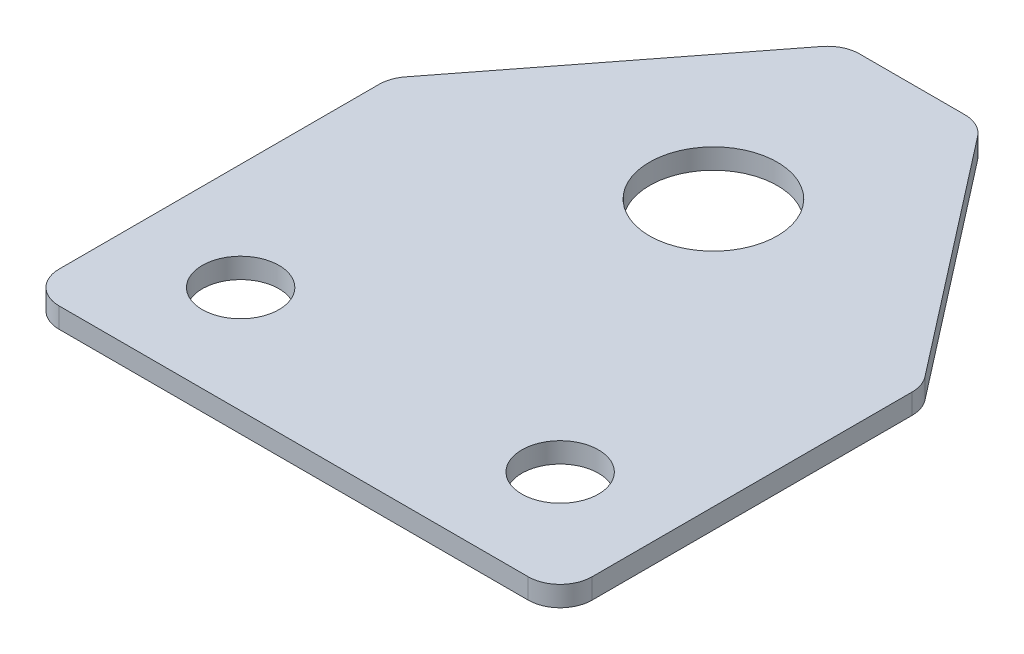
ISO-10303-21;
HEADER;
FILE_DESCRIPTION(('STEP AP214'),'2;1');
FILE_NAME('part.step','',(''),(''),'','','');
FILE_SCHEMA(('AUTOMOTIVE_DESIGN { 1 0 10303 214 1 1 1 1 }'));
ENDSEC;
DATA;
#1=APPLICATION_CONTEXT('core data for automotive mechanical design processes');
#2=APPLICATION_PROTOCOL_DEFINITION('international standard','automotive_design',2000,#1);
#3=PRODUCT_CONTEXT('',#1,'mechanical');
#4=PRODUCT('Part','Part','',(#3));
#5=PRODUCT_RELATED_PRODUCT_CATEGORY('part','',(#4));
#6=PRODUCT_DEFINITION_FORMATION('','',#4);
#7=PRODUCT_DEFINITION_CONTEXT('part definition',#1,'design');
#8=PRODUCT_DEFINITION('design','',#6,#7);
#9=PRODUCT_DEFINITION_SHAPE('','',#8);
#10=(LENGTH_UNIT() NAMED_UNIT(*) SI_UNIT(.MILLI.,.METRE.));
#11=(NAMED_UNIT(*) PLANE_ANGLE_UNIT() SI_UNIT($,.RADIAN.));
#12=(NAMED_UNIT(*) SI_UNIT($,.STERADIAN.) SOLID_ANGLE_UNIT());
#13=UNCERTAINTY_MEASURE_WITH_UNIT(LENGTH_MEASURE(1.E-05),#10,'distance_accuracy_value','');
#14=(GEOMETRIC_REPRESENTATION_CONTEXT(3) GLOBAL_UNCERTAINTY_ASSIGNED_CONTEXT((#13)) GLOBAL_UNIT_ASSIGNED_CONTEXT((#10,
#11,#12)) REPRESENTATION_CONTEXT('',''));
#15=CARTESIAN_POINT('',(0.,0.,0.));
#16=DIRECTION('',(0.,0.,1.));
#17=DIRECTION('',(1.,0.,0.));
#18=AXIS2_PLACEMENT_3D('',#15,#16,#17);
#19=CARTESIAN_POINT('',(21.7320599962479,-37.5,-16.8513372857907));
#20=DIRECTION('',(-0.790256727136287,0.,0.612775901301481));
#21=DIRECTION('',(0.612775901301482,0.,0.790256727136288));
#22=AXIS2_PLACEMENT_3D('',#19,#20,#21);
#23=PLANE('',#22);
#24=DIRECTION('',(-0.612775901301482,0.,-0.790256727136288));
#25=VECTOR('',#24,1.);
#26=CARTESIAN_POINT('',(21.7320599962479,-37.5,-16.8513372857907));
#27=LINE('',#26,#25);
#28=CARTESIAN_POINT('',(40.6512836356814,-37.5,7.54753956544236));
#29=VERTEX_POINT('',#28);
#30=CARTESIAN_POINT('',(12.184745943063,-37.5,-29.1638795065074));
#31=VERTEX_POINT('',#30);
#32=EDGE_CURVE('E236',#29,#31,#27,.T.);
#33=ORIENTED_EDGE('',*,*,#32,.F.);
#34=DIRECTION('',(0.,-1.,0.));
#35=VECTOR('',#34,1.);
#36=CARTESIAN_POINT('',(40.6512836356814,-37.5,7.54753956544236));
#37=LINE('',#36,#35);
#38=CARTESIAN_POINT('',(40.6512836356814,-40.675,7.54753956544236));
#39=VERTEX_POINT('',#38);
#40=EDGE_CURVE('E201',#29,#39,#37,.T.);
#41=ORIENTED_EDGE('',*,*,#40,.T.);
#42=DIRECTION('',(-0.612775901301482,0.,-0.790256727136288));
#43=VECTOR('',#42,1.);
#44=CARTESIAN_POINT('',(21.7320599962479,-40.675,-16.8513372857907));
#45=LINE('',#44,#43);
#46=CARTESIAN_POINT('',(12.184745943063,-40.675,-29.1638795065074));
#47=VERTEX_POINT('',#46);
#48=EDGE_CURVE('E219',#39,#47,#45,.T.);
#49=ORIENTED_EDGE('',*,*,#48,.T.);
#50=DIRECTION('',(0.,-1.,0.));
#51=VECTOR('',#50,1.);
#52=CARTESIAN_POINT('',(12.184745943063,-37.5,-29.1638795065074));
#53=LINE('',#52,#51);
#54=EDGE_CURVE('E199',#47,#31,#53,.F.);
#55=ORIENTED_EDGE('',*,*,#54,.T.);
#56=EDGE_LOOP('',(#33,#41,#49,#55));
#57=FACE_BOUND('',#56,.T.);
#58=ADVANCED_FACE('F41',(#57),#23,.F.);
#59=CARTESIAN_POINT('',(0.,-37.5,-31.1));
#60=DIRECTION('',(0.,0.,-1.));
#61=DIRECTION('',(-1.,0.,0.));
#62=AXIS2_PLACEMENT_3D('',#59,#60,#61);
#63=PLANE('',#62);
#64=DIRECTION('',(1.,0.,0.));
#65=VECTOR('',#64,1.);
#66=CARTESIAN_POINT('',(0.,-40.675,-31.1));
#67=LINE('',#66,#65);
#68=CARTESIAN_POINT('',(-8.23346230738156,-40.675,-31.1));
#69=VERTEX_POINT('',#68);
#70=CARTESIAN_POINT('',(8.23346230738156,-40.675,-31.1));
#71=VERTEX_POINT('',#70);
#72=EDGE_CURVE('E210',#69,#71,#67,.T.);
#73=ORIENTED_EDGE('',*,*,#72,.F.);
#74=DIRECTION('',(0.,-1.,0.));
#75=VECTOR('',#74,1.);
#76=CARTESIAN_POINT('',(-8.23346230738156,-37.5,-31.1));
#77=LINE('',#76,#75);
#78=CARTESIAN_POINT('',(-8.23346230738156,-37.5,-31.1));
#79=VERTEX_POINT('',#78);
#80=EDGE_CURVE('E11',#69,#79,#77,.F.);
#81=ORIENTED_EDGE('',*,*,#80,.T.);
#82=DIRECTION('',(1.,0.,0.));
#83=VECTOR('',#82,1.);
#84=CARTESIAN_POINT('',(0.,-37.5,-31.1));
#85=LINE('',#84,#83);
#86=CARTESIAN_POINT('',(8.23346230738156,-37.5,-31.1));
#87=VERTEX_POINT('',#86);
#88=EDGE_CURVE('E213',#79,#87,#85,.T.);
#89=ORIENTED_EDGE('',*,*,#88,.T.);
#90=DIRECTION('',(0.,-1.,0.));
#91=VECTOR('',#90,1.);
#92=CARTESIAN_POINT('',(8.23346230738156,-40.675,-31.1));
#93=LINE('',#92,#91);
#94=EDGE_CURVE('E49',#87,#71,#93,.T.);
#95=ORIENTED_EDGE('',*,*,#94,.T.);
#96=EDGE_LOOP('',(#73,#81,#89,#95));
#97=FACE_BOUND('',#96,.T.);
#98=ADVANCED_FACE('F209',(#97),#63,.T.);
#99=CARTESIAN_POINT('',(-21.7320599962479,-37.5,-16.8513372857907));
#100=DIRECTION('',(-0.790256727136287,0.,-0.612775901301481));
#101=DIRECTION('',(-0.612775901301482,0.,0.790256727136288));
#102=AXIS2_PLACEMENT_3D('',#99,#100,#101);
#103=PLANE('',#102);
#104=DIRECTION('',(0.612775901301482,0.,-0.790256727136288));
#105=VECTOR('',#104,1.);
#106=CARTESIAN_POINT('',(-21.7320599962479,-40.675,-16.8513372857907));
#107=LINE('',#106,#105);
#108=CARTESIAN_POINT('',(-40.6512836356814,-40.675,7.54753956544235));
#109=VERTEX_POINT('',#108);
#110=CARTESIAN_POINT('',(-12.184745943063,-40.675,-29.1638795065074));
#111=VERTEX_POINT('',#110);
#112=EDGE_CURVE('E153',#109,#111,#107,.T.);
#113=ORIENTED_EDGE('',*,*,#112,.F.);
#114=DIRECTION('',(0.,-1.,0.));
#115=VECTOR('',#114,1.);
#116=CARTESIAN_POINT('',(-40.6512836356814,-37.5,7.54753956544235));
#117=LINE('',#116,#115);
#118=CARTESIAN_POINT('',(-40.6512836356814,-37.5,7.54753956544235));
#119=VERTEX_POINT('',#118);
#120=EDGE_CURVE('E179',#109,#119,#117,.F.);
#121=ORIENTED_EDGE('',*,*,#120,.T.);
#122=DIRECTION('',(0.612775901301482,0.,-0.790256727136288));
#123=VECTOR('',#122,1.);
#124=CARTESIAN_POINT('',(-21.7320599962479,-37.5,-16.8513372857907));
#125=LINE('',#124,#123);
#126=CARTESIAN_POINT('',(-12.184745943063,-37.5,-29.1638795065074));
#127=VERTEX_POINT('',#126);
#128=EDGE_CURVE('E244',#119,#127,#125,.T.);
#129=ORIENTED_EDGE('',*,*,#128,.T.);
#130=DIRECTION('',(0.,-1.,0.));
#131=VECTOR('',#130,1.);
#132=CARTESIAN_POINT('',(-12.184745943063,-37.5,-29.1638795065074));
#133=LINE('',#132,#131);
#134=EDGE_CURVE('E176',#127,#111,#133,.T.);
#135=ORIENTED_EDGE('',*,*,#134,.T.);
#136=EDGE_LOOP('',(#113,#121,#129,#135));
#137=FACE_BOUND('',#136,.T.);
#138=ADVANCED_FACE('F280',(#137),#103,.T.);
#139=CARTESIAN_POINT('',(-41.7,-37.5,0.));
#140=DIRECTION('',(-1.,0.,0.));
#141=DIRECTION('',(0.,0.,1.));
#142=AXIS2_PLACEMENT_3D('',#139,#140,#141);
#143=PLANE('',#142);
#144=DIRECTION('',(0.,0.,-1.));
#145=VECTOR('',#144,1.);
#146=CARTESIAN_POINT('',(-41.7,-37.5,0.));
#147=LINE('',#146,#145);
#148=CARTESIAN_POINT('',(-41.7,-37.5,60.679690495143));
#149=VERTEX_POINT('',#148);
#150=CARTESIAN_POINT('',(-41.7,-37.5,10.6114190719498));
#151=VERTEX_POINT('',#150);
#152=EDGE_CURVE('E247',#149,#151,#147,.T.);
#153=ORIENTED_EDGE('',*,*,#152,.T.);
#154=DIRECTION('',(0.,-1.,0.));
#155=VECTOR('',#154,1.);
#156=CARTESIAN_POINT('',(-41.7,-37.5,10.6114190719498));
#157=LINE('',#156,#155);
#158=CARTESIAN_POINT('',(-41.7,-40.675,10.6114190719498));
#159=VERTEX_POINT('',#158);
#160=EDGE_CURVE('E152',#151,#159,#157,.T.);
#161=ORIENTED_EDGE('',*,*,#160,.T.);
#162=DIRECTION('',(0.,0.,-1.));
#163=VECTOR('',#162,1.);
#164=CARTESIAN_POINT('',(-41.7,-40.675,0.));
#165=LINE('',#164,#163);
#166=CARTESIAN_POINT('',(-41.7,-40.675,60.679690495143));
#167=VERTEX_POINT('',#166);
#168=EDGE_CURVE('E135',#167,#159,#165,.T.);
#169=ORIENTED_EDGE('',*,*,#168,.F.);
#170=DIRECTION('',(0.,-1.,0.));
#171=VECTOR('',#170,1.);
#172=CARTESIAN_POINT('',(-41.7,-37.5,60.679690495143));
#173=LINE('',#172,#171);
#174=EDGE_CURVE('E149',#167,#149,#173,.F.);
#175=ORIENTED_EDGE('',*,*,#174,.T.);
#176=EDGE_LOOP('',(#153,#161,#169,#175));
#177=FACE_BOUND('',#176,.T.);
#178=ADVANCED_FACE('F148',(#177),#143,.T.);
#179=CARTESIAN_POINT('',(0.,-37.5,65.679690495143));
#180=DIRECTION('',(0.,0.,-1.));
#181=DIRECTION('',(-1.,0.,0.));
#182=AXIS2_PLACEMENT_3D('',#179,#180,#181);
#183=PLANE('',#182);
#184=DIRECTION('',(1.,0.,0.));
#185=VECTOR('',#184,1.);
#186=CARTESIAN_POINT('',(0.,-37.5,65.679690495143));
#187=LINE('',#186,#185);
#188=CARTESIAN_POINT('',(-36.7,-37.5,65.679690495143));
#189=VERTEX_POINT('',#188);
#190=CARTESIAN_POINT('',(36.7,-37.5,65.679690495143));
#191=VERTEX_POINT('',#190);
#192=EDGE_CURVE('E249',#189,#191,#187,.T.);
#193=ORIENTED_EDGE('',*,*,#192,.F.);
#194=DIRECTION('',(0.,-1.,0.));
#195=VECTOR('',#194,1.);
#196=CARTESIAN_POINT('',(-36.7,-40.675,65.679690495143));
#197=LINE('',#196,#195);
#198=CARTESIAN_POINT('',(-36.7,-40.675,65.679690495143));
#199=VERTEX_POINT('',#198);
#200=EDGE_CURVE('E193',#189,#199,#197,.T.);
#201=ORIENTED_EDGE('',*,*,#200,.T.);
#202=DIRECTION('',(1.,0.,0.));
#203=VECTOR('',#202,1.);
#204=CARTESIAN_POINT('',(0.,-40.675,65.679690495143));
#205=LINE('',#204,#203);
#206=CARTESIAN_POINT('',(36.7,-40.675,65.679690495143));
#207=VERTEX_POINT('',#206);
#208=EDGE_CURVE('E137',#199,#207,#205,.T.);
#209=ORIENTED_EDGE('',*,*,#208,.T.);
#210=DIRECTION('',(0.,-1.,0.));
#211=VECTOR('',#210,1.);
#212=CARTESIAN_POINT('',(36.7,-37.5,65.679690495143));
#213=LINE('',#212,#211);
#214=EDGE_CURVE('E191',#207,#191,#213,.F.);
#215=ORIENTED_EDGE('',*,*,#214,.T.);
#216=EDGE_LOOP('',(#193,#201,#209,#215));
#217=FACE_BOUND('',#216,.T.);
#218=ADVANCED_FACE('F289',(#217),#183,.F.);
#219=CARTESIAN_POINT('',(25.,-37.5,48.979690495143));
#220=DIRECTION('',(0.,-1.,0.));
#221=DIRECTION('',(0.,0.,-1.));
#222=AXIS2_PLACEMENT_3D('',#219,#220,#221);
#223=CYLINDRICAL_SURFACE('',#222,6.00000000000001);
#224=CARTESIAN_POINT('',(25.,-37.5,48.979690495143));
#225=DIRECTION('',(0.,1.,0.));
#226=DIRECTION('',(0.,0.,1.));
#227=AXIS2_PLACEMENT_3D('',#224,#225,#226);
#228=CIRCLE('',#227,6.00000000000001);
#229=CARTESIAN_POINT('',(25.,-37.5,54.979690495143));
#230=VERTEX_POINT('',#229);
#231=EDGE_CURVE('E163',#230,#230,#228,.T.);
#232=ORIENTED_EDGE('',*,*,#231,.T.);
#233=EDGE_LOOP('',(#232));
#234=FACE_BOUND('',#233,.T.);
#235=CARTESIAN_POINT('',(25.,-40.675,48.979690495143));
#236=DIRECTION('',(0.,1.,0.));
#237=DIRECTION('',(0.,0.,1.));
#238=AXIS2_PLACEMENT_3D('',#235,#236,#237);
#239=CIRCLE('',#238,6.00000000000001);
#240=CARTESIAN_POINT('',(25.,-40.675,54.979690495143));
#241=VERTEX_POINT('',#240);
#242=EDGE_CURVE('E228',#241,#241,#239,.T.);
#243=ORIENTED_EDGE('',*,*,#242,.F.);
#244=EDGE_LOOP('',(#243));
#245=FACE_BOUND('',#244,.T.);
#246=ADVANCED_FACE('F271',(#234,#245),#223,.F.);
#247=CARTESIAN_POINT('',(41.7,-37.5,0.));
#248=DIRECTION('',(-1.,0.,0.));
#249=DIRECTION('',(0.,0.,1.));
#250=AXIS2_PLACEMENT_3D('',#247,#248,#249);
#251=PLANE('',#250);
#252=DIRECTION('',(0.,0.,-1.));
#253=VECTOR('',#252,1.);
#254=CARTESIAN_POINT('',(41.7,-37.5,0.));
#255=LINE('',#254,#253);
#256=CARTESIAN_POINT('',(41.7,-37.5,60.679690495143));
#257=VERTEX_POINT('',#256);
#258=CARTESIAN_POINT('',(41.7,-37.5,10.6114190719498));
#259=VERTEX_POINT('',#258);
#260=EDGE_CURVE('E251',#257,#259,#255,.T.);
#261=ORIENTED_EDGE('',*,*,#260,.F.);
#262=DIRECTION('',(0.,-1.,0.));
#263=VECTOR('',#262,1.);
#264=CARTESIAN_POINT('',(41.7,-37.5,60.679690495143));
#265=LINE('',#264,#263);
#266=CARTESIAN_POINT('',(41.7,-40.675,60.679690495143));
#267=VERTEX_POINT('',#266);
#268=EDGE_CURVE('E196',#257,#267,#265,.T.);
#269=ORIENTED_EDGE('',*,*,#268,.T.);
#270=DIRECTION('',(0.,0.,-1.));
#271=VECTOR('',#270,1.);
#272=CARTESIAN_POINT('',(41.7,-40.675,0.));
#273=LINE('',#272,#271);
#274=CARTESIAN_POINT('',(41.7,-40.675,10.6114190719498));
#275=VERTEX_POINT('',#274);
#276=EDGE_CURVE('E227',#267,#275,#273,.T.);
#277=ORIENTED_EDGE('',*,*,#276,.T.);
#278=DIRECTION('',(0.,-1.,0.));
#279=VECTOR('',#278,1.);
#280=CARTESIAN_POINT('',(41.7,-37.5,10.6114190719498));
#281=LINE('',#280,#279);
#282=EDGE_CURVE('E56',#275,#259,#281,.F.);
#283=ORIENTED_EDGE('',*,*,#282,.T.);
#284=EDGE_LOOP('',(#261,#269,#277,#283));
#285=FACE_BOUND('',#284,.T.);
#286=ADVANCED_FACE('F261',(#285),#251,.F.);
#287=CARTESIAN_POINT('',(0.,-37.5,0.));
#288=DIRECTION('',(0.,-1.,0.));
#289=DIRECTION('',(0.,0.,-1.));
#290=AXIS2_PLACEMENT_3D('',#287,#288,#289);
#291=CYLINDRICAL_SURFACE('',#290,9.99999999988858);
#292=CARTESIAN_POINT('',(0.,-37.5,0.));
#293=DIRECTION('',(0.,1.,0.));
#294=DIRECTION('',(0.,0.,1.));
#295=AXIS2_PLACEMENT_3D('',#292,#293,#294);
#296=CIRCLE('',#295,9.99999999988858);
#297=CARTESIAN_POINT('',(0.,-37.5,9.99999999988858));
#298=VERTEX_POINT('',#297);
#299=EDGE_CURVE('E232',#298,#298,#296,.T.);
#300=ORIENTED_EDGE('',*,*,#299,.T.);
#301=EDGE_LOOP('',(#300));
#302=FACE_BOUND('',#301,.T.);
#303=CARTESIAN_POINT('',(0.,-40.675,0.));
#304=DIRECTION('',(0.,1.,0.));
#305=DIRECTION('',(0.,0.,1.));
#306=AXIS2_PLACEMENT_3D('',#303,#304,#305);
#307=CIRCLE('',#306,9.99999999988858);
#308=CARTESIAN_POINT('',(0.,-40.675,9.99999999988858));
#309=VERTEX_POINT('',#308);
#310=EDGE_CURVE('E222',#309,#309,#307,.T.);
#311=ORIENTED_EDGE('',*,*,#310,.F.);
#312=EDGE_LOOP('',(#311));
#313=FACE_BOUND('',#312,.T.);
#314=ADVANCED_FACE('F258',(#302,#313),#291,.F.);
#315=CARTESIAN_POINT('',(-25.,-37.5,48.979690495143));
#316=DIRECTION('',(0.,-1.,0.));
#317=DIRECTION('',(0.,0.,-1.));
#318=AXIS2_PLACEMENT_3D('',#315,#316,#317);
#319=CYLINDRICAL_SURFACE('',#318,6.);
#320=CARTESIAN_POINT('',(-25.,-37.5,48.979690495143));
#321=DIRECTION('',(0.,1.,0.));
#322=DIRECTION('',(0.,0.,1.));
#323=AXIS2_PLACEMENT_3D('',#320,#321,#322);
#324=CIRCLE('',#323,6.);
#325=CARTESIAN_POINT('',(-25.,-37.5,54.979690495143));
#326=VERTEX_POINT('',#325);
#327=EDGE_CURVE('E158',#326,#326,#324,.T.);
#328=ORIENTED_EDGE('',*,*,#327,.T.);
#329=EDGE_LOOP('',(#328));
#330=FACE_BOUND('',#329,.T.);
#331=CARTESIAN_POINT('',(-25.,-40.675,48.979690495143));
#332=DIRECTION('',(0.,1.,0.));
#333=DIRECTION('',(0.,0.,1.));
#334=AXIS2_PLACEMENT_3D('',#331,#332,#333);
#335=CIRCLE('',#334,6.);
#336=CARTESIAN_POINT('',(-25.,-40.675,54.979690495143));
#337=VERTEX_POINT('',#336);
#338=EDGE_CURVE('E166',#337,#337,#335,.T.);
#339=ORIENTED_EDGE('',*,*,#338,.F.);
#340=EDGE_LOOP('',(#339));
#341=FACE_BOUND('',#340,.T.);
#342=ADVANCED_FACE('F260',(#330,#341),#319,.F.);
#343=CARTESIAN_POINT('',(0.,-37.5,0.));
#344=DIRECTION('',(0.,1.,0.));
#345=DIRECTION('',(0.,0.,1.));
#346=AXIS2_PLACEMENT_3D('',#343,#344,#345);
#347=PLANE('',#346);
#348=ORIENTED_EDGE('',*,*,#299,.F.);
#349=EDGE_LOOP('',(#348));
#350=FACE_BOUND('',#349,.T.);
#351=ORIENTED_EDGE('',*,*,#128,.F.);
#352=CARTESIAN_POINT('',(-36.7,-37.5,10.6114190719498));
#353=DIRECTION('',(0.,1.,0.));
#354=DIRECTION('',(0.,0.,1.));
#355=AXIS2_PLACEMENT_3D('',#352,#353,#354);
#356=CIRCLE('',#355,5.);
#357=EDGE_CURVE('E189',#119,#151,#356,.T.);
#358=ORIENTED_EDGE('',*,*,#357,.T.);
#359=ORIENTED_EDGE('',*,*,#152,.F.);
#360=CARTESIAN_POINT('',(-36.7,-37.5,60.679690495143));
#361=DIRECTION('',(0.,1.,0.));
#362=DIRECTION('',(0.,0.,1.));
#363=AXIS2_PLACEMENT_3D('',#360,#361,#362);
#364=CIRCLE('',#363,5.);
#365=EDGE_CURVE('E157',#149,#189,#364,.T.);
#366=ORIENTED_EDGE('',*,*,#365,.T.);
#367=ORIENTED_EDGE('',*,*,#192,.T.);
#368=CARTESIAN_POINT('',(36.7,-37.5,60.679690495143));
#369=DIRECTION('',(0.,1.,0.));
#370=DIRECTION('',(0.,0.,1.));
#371=AXIS2_PLACEMENT_3D('',#368,#369,#370);
#372=CIRCLE('',#371,5.);
#373=EDGE_CURVE('E63',#191,#257,#372,.T.);
#374=ORIENTED_EDGE('',*,*,#373,.T.);
#375=ORIENTED_EDGE('',*,*,#260,.T.);
#376=CARTESIAN_POINT('',(36.7,-37.5,10.6114190719498));
#377=DIRECTION('',(0.,1.,0.));
#378=DIRECTION('',(0.,0.,1.));
#379=AXIS2_PLACEMENT_3D('',#376,#377,#378);
#380=CIRCLE('',#379,5.);
#381=EDGE_CURVE('E185',#259,#29,#380,.T.);
#382=ORIENTED_EDGE('',*,*,#381,.T.);
#383=ORIENTED_EDGE('',*,*,#32,.T.);
#384=CARTESIAN_POINT('',(8.23346230738156,-37.5,-26.1));
#385=DIRECTION('',(0.,1.,0.));
#386=DIRECTION('',(0.,0.,1.));
#387=AXIS2_PLACEMENT_3D('',#384,#385,#386);
#388=CIRCLE('',#387,5.);
#389=EDGE_CURVE('E181',#31,#87,#388,.T.);
#390=ORIENTED_EDGE('',*,*,#389,.T.);
#391=ORIENTED_EDGE('',*,*,#88,.F.);
#392=CARTESIAN_POINT('',(-8.23346230738156,-37.5,-26.1));
#393=DIRECTION('',(0.,1.,0.));
#394=DIRECTION('',(0.,0.,1.));
#395=AXIS2_PLACEMENT_3D('',#392,#393,#394);
#396=CIRCLE('',#395,5.);
#397=EDGE_CURVE('E183',#79,#127,#396,.T.);
#398=ORIENTED_EDGE('',*,*,#397,.T.);
#399=EDGE_LOOP('',(#351,#358,#359,#366,#367,#374,#375,#382,#383,#390,#391,#398));
#400=FACE_BOUND('',#399,.T.);
#401=ORIENTED_EDGE('',*,*,#231,.F.);
#402=EDGE_LOOP('',(#401));
#403=FACE_BOUND('',#402,.T.);
#404=ORIENTED_EDGE('',*,*,#327,.F.);
#405=EDGE_LOOP('',(#404));
#406=FACE_BOUND('',#405,.T.);
#407=ADVANCED_FACE('F267',(#350,#400,#403,#406),#347,.T.);
#408=CARTESIAN_POINT('',(0.,-40.675,0.));
#409=DIRECTION('',(0.,1.,0.));
#410=DIRECTION('',(0.,0.,1.));
#411=AXIS2_PLACEMENT_3D('',#408,#409,#410);
#412=PLANE('',#411);
#413=ORIENTED_EDGE('',*,*,#310,.T.);
#414=EDGE_LOOP('',(#413));
#415=FACE_BOUND('',#414,.T.);
#416=ORIENTED_EDGE('',*,*,#168,.T.);
#417=CARTESIAN_POINT('',(-36.7,-40.675,10.6114190719498));
#418=DIRECTION('',(0.,1.,0.));
#419=DIRECTION('',(0.,0.,1.));
#420=AXIS2_PLACEMENT_3D('',#417,#418,#419);
#421=CIRCLE('',#420,5.);
#422=EDGE_CURVE('E142',#159,#109,#421,.F.);
#423=ORIENTED_EDGE('',*,*,#422,.T.);
#424=ORIENTED_EDGE('',*,*,#112,.T.);
#425=CARTESIAN_POINT('',(-8.23346230738156,-40.675,-26.1));
#426=DIRECTION('',(0.,1.,0.));
#427=DIRECTION('',(0.,0.,1.));
#428=AXIS2_PLACEMENT_3D('',#425,#426,#427);
#429=CIRCLE('',#428,5.);
#430=EDGE_CURVE('E170',#111,#69,#429,.F.);
#431=ORIENTED_EDGE('',*,*,#430,.T.);
#432=ORIENTED_EDGE('',*,*,#72,.T.);
#433=CARTESIAN_POINT('',(8.23346230738156,-40.675,-26.1));
#434=DIRECTION('',(0.,1.,0.));
#435=DIRECTION('',(0.,0.,1.));
#436=AXIS2_PLACEMENT_3D('',#433,#434,#435);
#437=CIRCLE('',#436,5.);
#438=EDGE_CURVE('E160',#71,#47,#437,.F.);
#439=ORIENTED_EDGE('',*,*,#438,.T.);
#440=ORIENTED_EDGE('',*,*,#48,.F.);
#441=CARTESIAN_POINT('',(36.7,-40.675,10.6114190719498));
#442=DIRECTION('',(0.,1.,0.));
#443=DIRECTION('',(0.,0.,1.));
#444=AXIS2_PLACEMENT_3D('',#441,#442,#443);
#445=CIRCLE('',#444,5.);
#446=EDGE_CURVE('E172',#39,#275,#445,.F.);
#447=ORIENTED_EDGE('',*,*,#446,.T.);
#448=ORIENTED_EDGE('',*,*,#276,.F.);
#449=CARTESIAN_POINT('',(36.7,-40.675,60.679690495143));
#450=DIRECTION('',(0.,1.,0.));
#451=DIRECTION('',(0.,0.,1.));
#452=AXIS2_PLACEMENT_3D('',#449,#450,#451);
#453=CIRCLE('',#452,5.);
#454=EDGE_CURVE('E143',#267,#207,#453,.F.);
#455=ORIENTED_EDGE('',*,*,#454,.T.);
#456=ORIENTED_EDGE('',*,*,#208,.F.);
#457=CARTESIAN_POINT('',(-36.7,-40.675,60.679690495143));
#458=DIRECTION('',(0.,1.,0.));
#459=DIRECTION('',(0.,0.,1.));
#460=AXIS2_PLACEMENT_3D('',#457,#458,#459);
#461=CIRCLE('',#460,5.);
#462=EDGE_CURVE('E131',#199,#167,#461,.F.);
#463=ORIENTED_EDGE('',*,*,#462,.T.);
#464=EDGE_LOOP('',(#416,#423,#424,#431,#432,#439,#440,#447,#448,#455,#456,#463));
#465=FACE_BOUND('',#464,.T.);
#466=ORIENTED_EDGE('',*,*,#242,.T.);
#467=EDGE_LOOP('',(#466));
#468=FACE_BOUND('',#467,.T.);
#469=ORIENTED_EDGE('',*,*,#338,.T.);
#470=EDGE_LOOP('',(#469));
#471=FACE_BOUND('',#470,.T.);
#472=ADVANCED_FACE('F133',(#415,#465,#468,#471),#412,.F.);
#473=CARTESIAN_POINT('',(-36.7,-37.5,10.6114190719498));
#474=DIRECTION('',(0.,-1.,0.));
#475=DIRECTION('',(0.,0.,-1.));
#476=AXIS2_PLACEMENT_3D('',#473,#474,#475);
#477=CYLINDRICAL_SURFACE('',#476,5.);
#478=ORIENTED_EDGE('',*,*,#357,.F.);
#479=ORIENTED_EDGE('',*,*,#120,.F.);
#480=ORIENTED_EDGE('',*,*,#422,.F.);
#481=ORIENTED_EDGE('',*,*,#160,.F.);
#482=EDGE_LOOP('',(#478,#479,#480,#481));
#483=FACE_BOUND('',#482,.T.);
#484=ADVANCED_FACE('F297',(#483),#477,.T.);
#485=CARTESIAN_POINT('',(-36.7,-37.5,60.679690495143));
#486=DIRECTION('',(0.,1.,0.));
#487=DIRECTION('',(0.,0.,1.));
#488=AXIS2_PLACEMENT_3D('',#485,#486,#487);
#489=CYLINDRICAL_SURFACE('',#488,5.);
#490=ORIENTED_EDGE('',*,*,#365,.F.);
#491=ORIENTED_EDGE('',*,*,#174,.F.);
#492=ORIENTED_EDGE('',*,*,#462,.F.);
#493=ORIENTED_EDGE('',*,*,#200,.F.);
#494=EDGE_LOOP('',(#490,#491,#492,#493));
#495=FACE_BOUND('',#494,.T.);
#496=ADVANCED_FACE('F156',(#495),#489,.T.);
#497=CARTESIAN_POINT('',(36.7,-37.5,60.679690495143));
#498=DIRECTION('',(0.,-1.,0.));
#499=DIRECTION('',(0.,0.,-1.));
#500=AXIS2_PLACEMENT_3D('',#497,#498,#499);
#501=CYLINDRICAL_SURFACE('',#500,5.);
#502=ORIENTED_EDGE('',*,*,#373,.F.);
#503=ORIENTED_EDGE('',*,*,#214,.F.);
#504=ORIENTED_EDGE('',*,*,#454,.F.);
#505=ORIENTED_EDGE('',*,*,#268,.F.);
#506=EDGE_LOOP('',(#502,#503,#504,#505));
#507=FACE_BOUND('',#506,.T.);
#508=ADVANCED_FACE('F325',(#507),#501,.T.);
#509=CARTESIAN_POINT('',(36.7,-37.5,10.6114190719498));
#510=DIRECTION('',(0.,-1.,0.));
#511=DIRECTION('',(0.,0.,-1.));
#512=AXIS2_PLACEMENT_3D('',#509,#510,#511);
#513=CYLINDRICAL_SURFACE('',#512,5.);
#514=ORIENTED_EDGE('',*,*,#381,.F.);
#515=ORIENTED_EDGE('',*,*,#282,.F.);
#516=ORIENTED_EDGE('',*,*,#446,.F.);
#517=ORIENTED_EDGE('',*,*,#40,.F.);
#518=EDGE_LOOP('',(#514,#515,#516,#517));
#519=FACE_BOUND('',#518,.T.);
#520=ADVANCED_FACE('F323',(#519),#513,.T.);
#521=CARTESIAN_POINT('',(-8.23346230738156,-37.5,-26.1));
#522=DIRECTION('',(0.,-1.,0.));
#523=DIRECTION('',(0.,0.,-1.));
#524=AXIS2_PLACEMENT_3D('',#521,#522,#523);
#525=CYLINDRICAL_SURFACE('',#524,5.);
#526=ORIENTED_EDGE('',*,*,#397,.F.);
#527=ORIENTED_EDGE('',*,*,#80,.F.);
#528=ORIENTED_EDGE('',*,*,#430,.F.);
#529=ORIENTED_EDGE('',*,*,#134,.F.);
#530=EDGE_LOOP('',(#526,#527,#528,#529));
#531=FACE_BOUND('',#530,.T.);
#532=ADVANCED_FACE('F316',(#531),#525,.T.);
#533=CARTESIAN_POINT('',(8.23346230738156,-37.5,-26.1));
#534=DIRECTION('',(0.,1.,0.));
#535=DIRECTION('',(0.,0.,1.));
#536=AXIS2_PLACEMENT_3D('',#533,#534,#535);
#537=CYLINDRICAL_SURFACE('',#536,5.);
#538=ORIENTED_EDGE('',*,*,#389,.F.);
#539=ORIENTED_EDGE('',*,*,#54,.F.);
#540=ORIENTED_EDGE('',*,*,#438,.F.);
#541=ORIENTED_EDGE('',*,*,#94,.F.);
#542=EDGE_LOOP('',(#538,#539,#540,#541));
#543=FACE_BOUND('',#542,.T.);
#544=ADVANCED_FACE('F43',(#543),#537,.T.);
#545=CLOSED_SHELL('',(#58,#98,#138,#178,#218,#246,#286,#314,#342,#407,#472,#484,#496,#508,#520,
#532,#544));
#546=MANIFOLD_SOLID_BREP('B2',#545);
#547=ADVANCED_BREP_SHAPE_REPRESENTATION('',(#18,#546),#14);
#548=SHAPE_DEFINITION_REPRESENTATION(#9,#547);
ENDSEC;
END-ISO-10303-21;
